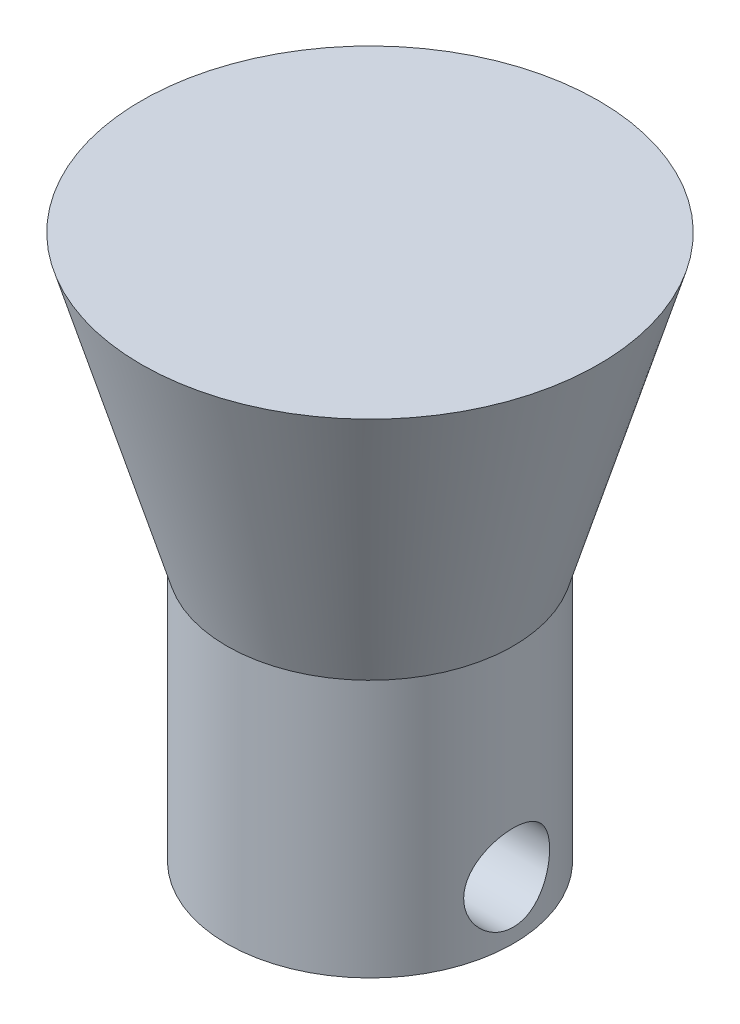
ISO-10303-21;
HEADER;
FILE_DESCRIPTION(('STEP AP214'),'2;1');
FILE_NAME('part.step','',(''),(''),'','','');
FILE_SCHEMA(('AUTOMOTIVE_DESIGN { 1 0 10303 214 1 1 1 1 }'));
ENDSEC;
DATA;
#1=APPLICATION_CONTEXT('core data for automotive mechanical design processes');
#2=APPLICATION_PROTOCOL_DEFINITION('international standard','automotive_design',2000,#1);
#3=PRODUCT_CONTEXT('',#1,'mechanical');
#4=PRODUCT('Part','Part','',(#3));
#5=PRODUCT_RELATED_PRODUCT_CATEGORY('part','',(#4));
#6=PRODUCT_DEFINITION_FORMATION('','',#4);
#7=PRODUCT_DEFINITION_CONTEXT('part definition',#1,'design');
#8=PRODUCT_DEFINITION('design','',#6,#7);
#9=PRODUCT_DEFINITION_SHAPE('','',#8);
#10=(LENGTH_UNIT() NAMED_UNIT(*) SI_UNIT(.MILLI.,.METRE.));
#11=(NAMED_UNIT(*) PLANE_ANGLE_UNIT() SI_UNIT($,.RADIAN.));
#12=(NAMED_UNIT(*) SI_UNIT($,.STERADIAN.) SOLID_ANGLE_UNIT());
#13=UNCERTAINTY_MEASURE_WITH_UNIT(LENGTH_MEASURE(1.E-05),#10,'distance_accuracy_value','');
#14=(GEOMETRIC_REPRESENTATION_CONTEXT(3) GLOBAL_UNCERTAINTY_ASSIGNED_CONTEXT((#13)) GLOBAL_UNIT_ASSIGNED_CONTEXT((#10,
#11,#12)) REPRESENTATION_CONTEXT('',''));
#15=CARTESIAN_POINT('',(0.,0.,0.));
#16=DIRECTION('',(0.,0.,1.));
#17=DIRECTION('',(1.,0.,0.));
#18=AXIS2_PLACEMENT_3D('',#15,#16,#17);
#19=CARTESIAN_POINT('',(0.,9.,0.));
#20=DIRECTION('',(0.,-1.,0.));
#21=DIRECTION('',(0.,0.,-1.));
#22=AXIS2_PLACEMENT_3D('',#19,#20,#21);
#23=CYLINDRICAL_SURFACE('',#22,5.);
#24=CARTESIAN_POINT('',(-5.,0.5,0.));
#25=CARTESIAN_POINT('',(-4.9999992925055,0.500000997484886,-0.0822886127533));
#26=CARTESIAN_POINT('',(-4.99794915693954,0.506793863623966,-0.164587318351529));
#27=CARTESIAN_POINT('',(-4.98997105593691,0.533721354222101,-0.326788125304881));
#28=CARTESIAN_POINT('',(-4.98404193389692,0.553859958023342,-0.40668950441142));
#29=CARTESIAN_POINT('',(-4.96895552501836,0.606746016910264,-0.561732707754527));
#30=CARTESIAN_POINT('',(-4.95980300250425,0.639474869618937,-0.636881364395373));
#31=CARTESIAN_POINT('',(-4.93922109237645,0.716536093055836,-0.780624181053131));
#32=CARTESIAN_POINT('',(-4.92779140192067,0.760870007395417,-0.84921746746967));
#33=CARTESIAN_POINT('',(-4.90350737192774,0.861224007472669,-0.979871797183745));
#34=CARTESIAN_POINT('',(-4.89062383657036,0.917516625885914,-1.04171807124434));
#35=CARTESIAN_POINT('',(-4.86505834210442,1.03960922991018,-1.15524920923324));
#36=CARTESIAN_POINT('',(-4.85237641724501,1.10541081212496,-1.20693236327441));
#37=CARTESIAN_POINT('',(-4.82834113993772,1.24647075303761,-1.29980037723708));
#38=CARTESIAN_POINT('',(-4.81702406663875,1.32190846099074,-1.34072309022213));
#39=CARTESIAN_POINT('',(-4.79743620394031,1.47898925423029,-1.4092139477476));
#40=CARTESIAN_POINT('',(-4.78916468313311,1.56063084392798,-1.43678529919973));
#41=CARTESIAN_POINT('',(-4.77690870838434,1.72539026613046,-1.47701633682652));
#42=CARTESIAN_POINT('',(-4.77281069324533,1.80840274386394,-1.49007196234677));
#43=CARTESIAN_POINT('',(-4.76902789749767,1.97553315621677,-1.50213730614672));
#44=CARTESIAN_POINT('',(-4.76934204760571,2.05965081805909,-1.50115042761078));
#45=CARTESIAN_POINT('',(-4.77424744067778,2.22338390860848,-1.48546977199812));
#46=CARTESIAN_POINT('',(-4.7786838859914,2.30305225036224,-1.47127205262685));
#47=CARTESIAN_POINT('',(-4.79108356228624,2.45881978627346,-1.43037420427056));
#48=CARTESIAN_POINT('',(-4.79904714132351,2.53491862737433,-1.40367284141641));
#49=CARTESIAN_POINT('',(-4.81772733074973,2.68260034966074,-1.33816026653682));
#50=CARTESIAN_POINT('',(-4.82848016115952,2.75410708395526,-1.29918816934642));
#51=CARTESIAN_POINT('',(-4.85150987000065,2.88973202201019,-1.21035222588683));
#52=CARTESIAN_POINT('',(-4.86378711746991,2.95384842941378,-1.16048574002588));
#53=CARTESIAN_POINT('',(-4.88911011297937,3.07568619076202,-1.04881290765546));
#54=CARTESIAN_POINT('',(-4.90216654310498,3.13302866402967,-0.986594907466972));
#55=CARTESIAN_POINT('',(-4.92712244063259,3.23655398406425,-0.853263259313967));
#56=CARTESIAN_POINT('',(-4.9390218351841,3.28273612841443,-0.782149051860888));
#57=CARTESIAN_POINT('',(-4.9604316006947,3.36285992246473,-0.632355038342803));
#58=CARTESIAN_POINT('',(-4.96992543668314,3.39671751624986,-0.55362774974795));
#59=CARTESIAN_POINT('',(-4.98533521832222,3.45059959009963,-0.39124541560352));
#60=CARTESIAN_POINT('',(-4.99125216186999,3.47062792853249,-0.307591751589582));
#61=CARTESIAN_POINT('',(-4.99868364643538,3.49565217789939,-0.140952242668332));
#62=CARTESIAN_POINT('',(-5.0003485041779,3.50116158580161,-0.0580500976011871));
#63=CARTESIAN_POINT('',(-4.9995292324176,3.49843084428792,0.107499605823383));
#64=CARTESIAN_POINT('',(-4.99704565677756,3.49019253034856,0.19014719669078));
#65=CARTESIAN_POINT('',(-4.98830696987163,3.4606153888885,0.350903605309697));
#66=CARTESIAN_POINT('',(-4.98213829799417,3.43957661241913,0.429072772614169));
#67=CARTESIAN_POINT('',(-4.96674347841533,3.3853567672218,0.580754638954522));
#68=CARTESIAN_POINT('',(-4.95751696321085,3.35217423896214,0.654266777025583));
#69=CARTESIAN_POINT('',(-4.93669654351325,3.27374683451887,0.796437189461052));
#70=CARTESIAN_POINT('',(-4.92505280829675,3.22824065905203,0.864943826199669));
#71=CARTESIAN_POINT('',(-4.90073468764318,3.12677524594719,0.993523307980147));
#72=CARTESIAN_POINT('',(-4.8880600443108,3.07081338811233,1.05359403235593));
#73=CARTESIAN_POINT('',(-4.86253171869138,2.94761269163066,1.16585744551027));
#74=CARTESIAN_POINT('',(-4.84968825033268,2.88003812422826,1.21768481231503));
#75=CARTESIAN_POINT('',(-4.82576515238464,2.73687206098647,1.30928995072154));
#76=CARTESIAN_POINT('',(-4.81468547654651,2.66128077544179,1.34906803829472));
#77=CARTESIAN_POINT('',(-4.79567189615055,2.50446750874531,1.41517347127168));
#78=CARTESIAN_POINT('',(-4.78772337843827,2.42327381346341,1.4415634693705));
#79=CARTESIAN_POINT('',(-4.77591594362794,2.25731203106852,1.48021730815114));
#80=CARTESIAN_POINT('',(-4.772055625083,2.17254517921233,1.49248598978779));
#81=CARTESIAN_POINT('',(-4.76899972496087,2.00563848162377,1.50221984485059));
#82=CARTESIAN_POINT('',(-4.76961647442754,1.92353634898242,1.5002805530849));
#83=CARTESIAN_POINT('',(-4.77499401288294,1.7608858966272,1.48307505444813));
#84=CARTESIAN_POINT('',(-4.77975463592551,1.68033751482365,1.46780938124716));
#85=CARTESIAN_POINT('',(-4.79275763670385,1.52405460085715,1.42476888804136));
#86=CARTESIAN_POINT('',(-4.80095604545965,1.44827271263831,1.39715175507068));
#87=CARTESIAN_POINT('',(-4.81990278909136,1.30235756118228,1.33031507121129));
#88=CARTESIAN_POINT('',(-4.83065161194312,1.23222538235924,1.29109329962876));
#89=CARTESIAN_POINT('',(-4.85397676425833,1.09683688347289,1.20048763805072));
#90=CARTESIAN_POINT('',(-4.86660540163798,1.03185123873959,1.14871276092994));
#91=CARTESIAN_POINT('',(-4.89201320450026,0.911297501692137,1.03517434629782));
#92=CARTESIAN_POINT('',(-4.90479240823905,0.855731860532243,0.973408217134502));
#93=CARTESIAN_POINT('',(-4.92950936570649,0.75397658770497,0.839465762183249));
#94=CARTESIAN_POINT('',(-4.94141159765674,0.708108553144511,0.767037885790608));
#95=CARTESIAN_POINT('',(-4.96260680455813,0.629264830095975,0.615141373983529));
#96=CARTESIAN_POINT('',(-4.97190099931067,0.596283111725492,0.535676052998955));
#97=CARTESIAN_POINT('',(-4.98602174969301,0.547104724347251,0.380757712655282));
#98=CARTESIAN_POINT('',(-4.99122027381068,0.529488327116752,0.305786961954234));
#99=CARTESIAN_POINT('',(-4.99820944494492,0.505936474758423,0.15388019523078));
#100=CARTESIAN_POINT('',(-5.0000006615474,0.499999067295181,0.0769445098581397));
#101=CARTESIAN_POINT('',(-5.,0.5,0.));
#102=B_SPLINE_CURVE_WITH_KNOTS('',3,(#24,#25,#26,#27,#28,#29,#30,#31,#32,#33,#34,#35,#36,#37,
#38,#39,#40,#41,#42,#43,#44,#45,#46,#47,#48,#49,#50,#51,#52,#53,#54,#55,#56,#57,#58,#59,#60,#61,
#62,#63,#64,#65,#66,#67,#68,#69,#70,#71,#72,#73,#74,#75,#76,#77,#78,#79,#80,#81,#82,#83,#84,#85,
#86,#87,#88,#89,#90,#91,#92,#93,#94,#95,#96,#97,#98,#99,#100,#101),.UNSPECIFIED.,.T.,.F.,(4,2,2,
2,2,2,2,2,2,2,2,2,2,2,2,2,2,2,2,2,2,2,2,2,2,2,2,2,2,2,2,2,2,2,2,2,2,2,4),(0.,0.246583203612611,
0.493239964846,0.739533676300874,0.985860164412702,1.23855602948191,1.49129437288633,
1.74971481004109,2.00807314543224,2.25919689356599,2.51025978319089,2.75226016697676,
2.99428443658001,3.23962426447119,3.48502360158555,3.74067104048166,3.99633456531071,
4.25371046881688,4.51101453528808,4.75908809438545,5.00712853550327,5.24956746682327,
5.49203554593728,5.74011305702908,5.98825282000191,6.24540400322818,6.5025484425268,
6.75847814951252,7.01432009460283,7.25950155466943,7.504673196616,7.74680040402721,
7.98897397553107,8.23996925679931,8.49102974897502,8.74942996156671,9.00770911595235,
9.23831691930459,9.46888616948874),.UNSPECIFIED.);
#103=CARTESIAN_POINT('',(-5.,0.5,0.));
#104=VERTEX_POINT('',#103);
#105=EDGE_CURVE('E11',#104,#104,#102,.T.);
#106=ORIENTED_EDGE('',*,*,#105,.T.);
#107=EDGE_LOOP('',(#106));
#108=FACE_BOUND('',#107,.T.);
#109=CARTESIAN_POINT('',(4.76969600708473,2.,-1.5));
#110=CARTESIAN_POINT('',(4.7696968572698,1.9178054520576,-1.49999897633764));
#111=CARTESIAN_POINT('',(4.77184390209069,1.83560077585598,-1.49322108167142));
#112=CARTESIAN_POINT('',(4.780165783029,1.67359475040806,-1.46635844446749));
#113=CARTESIAN_POINT('',(4.78634196493468,1.59379421349853,-1.44626925573578));
#114=CARTESIAN_POINT('',(4.80196102485632,1.43896527172827,-1.39352753269955));
#115=CARTESIAN_POINT('',(4.81139846703232,1.36392917036691,-1.36089589394243));
#116=CARTESIAN_POINT('',(4.83246932547567,1.2203780660047,-1.28406421917929));
#117=CARTESIAN_POINT('',(4.84410307041019,1.15186404131556,-1.23986245137053));
#118=CARTESIAN_POINT('',(4.86866862185765,1.02113360942262,-1.13964754141627));
#119=CARTESIAN_POINT('',(4.88162808311636,0.959154102053713,-1.08333207175807));
#120=CARTESIAN_POINT('',(4.90714861936757,0.845362048677491,-0.961136237579599));
#121=CARTESIAN_POINT('',(4.91970964297705,0.793550809550121,-0.895254645461111));
#122=CARTESIAN_POINT('',(4.94333214579389,0.700537300166693,-0.75411143779369));
#123=CARTESIAN_POINT('',(4.95435724342404,0.659576575557191,-0.678684021335815));
#124=CARTESIAN_POINT('',(4.97334435920684,0.591012740957243,-0.521624645369354));
#125=CARTESIAN_POINT('',(4.98130703789495,0.563406750142551,-0.439994028387912));
#126=CARTESIAN_POINT('',(4.99307646003589,0.523119998909491,-0.27532385263083));
#127=CARTESIAN_POINT('',(4.99699557369338,0.510034872347297,-0.192391398953801));
#128=CARTESIAN_POINT('',(5.00063201501348,0.497882675353559,-0.025421823749315));
#129=CARTESIAN_POINT('',(5.00035022521079,0.498812660598037,0.0586150620503682));
#130=CARTESIAN_POINT('',(4.99569603817659,0.514392868543023,0.22257115660016));
#131=CARTESIAN_POINT('',(4.9914542020526,0.528605193809869,0.302536267641341));
#132=CARTESIAN_POINT('',(4.97951522112593,0.56963133599429,0.458889213442527));
#133=CARTESIAN_POINT('',(4.97181785750586,0.596445950942671,0.535276821322846));
#134=CARTESIAN_POINT('',(4.95365220986963,0.662212023418558,0.683347326351281));
#135=CARTESIAN_POINT('',(4.94315269676706,0.701301202807267,0.754965064694478));
#136=CARTESIAN_POINT('',(4.92049640648069,0.790397852428228,0.890764673783156));
#137=CARTESIAN_POINT('',(4.90833923637778,0.840407912963484,0.954944774872131));
#138=CARTESIAN_POINT('',(4.88311550488165,0.952197750751597,1.0766604815298));
#139=CARTESIAN_POINT('',(4.87003195321461,1.01435691902974,1.13384458040111));
#140=CARTESIAN_POINT('',(4.84483979887497,1.14751001789005,1.23707651539824));
#141=CARTESIAN_POINT('',(4.8327312931702,1.21850482538923,1.28312324482853));
#142=CARTESIAN_POINT('',(4.81077903197678,1.36823946924899,1.3631399533545));
#143=CARTESIAN_POINT('',(4.80095810695957,1.44704704586292,1.39698989237679));
#144=CARTESIAN_POINT('',(4.78496392548436,1.60960720844554,1.45083362878413));
#145=CARTESIAN_POINT('',(4.7787894791583,1.69335817153456,1.4708319464056));
#146=CARTESIAN_POINT('',(4.77104849541241,1.86008236073928,1.49574770282165));
#147=CARTESIAN_POINT('',(4.7693187867044,1.94296822389398,1.50119946380212));
#148=CARTESIAN_POINT('',(4.77021192441924,2.10847290000987,1.49835947233062));
#149=CARTESIAN_POINT('',(4.77283416156589,2.19109174873085,1.4900696437133));
#150=CARTESIAN_POINT('',(4.78197558554912,2.35148837797087,1.4604576357419));
#151=CARTESIAN_POINT('',(4.78839176507489,2.42933616426352,1.4394796143128));
#152=CARTESIAN_POINT('',(4.80429141231227,2.58040169081492,1.3854857774794));
#153=CARTESIAN_POINT('',(4.81377535359073,2.65361871414057,1.3524681034276));
#154=CARTESIAN_POINT('',(4.83505835023047,2.79551746407213,1.274318711965));
#155=CARTESIAN_POINT('',(4.84691271069799,2.86402472098579,1.22888564172729));
#156=CARTESIAN_POINT('',(4.87148205646987,2.9926381061808,1.12755301600385));
#157=CARTESIAN_POINT('',(4.88419724730003,3.05274221761279,1.07165095534897));
#158=CARTESIAN_POINT('',(4.90963633548158,3.16518040581474,0.948455132493599));
#159=CARTESIAN_POINT('',(4.92234245063004,3.21713562898698,0.880811065857434));
#160=CARTESIAN_POINT('',(4.94584851748651,3.30896670102775,0.737461784590249));
#161=CARTESIAN_POINT('',(4.95664856384717,3.34884314978146,0.661756970543944));
#162=CARTESIAN_POINT('',(4.97505970474957,3.4150000305683,0.504935504705222));
#163=CARTESIAN_POINT('',(4.98269453424966,3.44138201615898,0.423864622037839));
#164=CARTESIAN_POINT('',(4.99401979596827,3.48006091889042,0.258169966504588));
#165=CARTESIAN_POINT('',(4.9977113567088,3.49236186594842,0.173547217354763));
#166=CARTESIAN_POINT('',(5.00066544081399,3.5022230440545,0.00665215388274265));
#167=CARTESIAN_POINT('',(5.00009305111322,3.50033269540783,-0.0755851790862068));
#168=CARTESIAN_POINT('',(4.99497264465037,3.48317836750088,-0.238519481164404));
#169=CARTESIAN_POINT('',(4.99042485330462,3.46791514651956,-0.319216537346529));
#170=CARTESIAN_POINT('',(4.97791168358327,3.42478833860038,-0.475935813041358));
#171=CARTESIAN_POINT('',(4.96998352900866,3.39706181935099,-0.551998927351392));
#172=CARTESIAN_POINT('',(4.9515294303945,3.32991808549281,-0.698433237752053));
#173=CARTESIAN_POINT('',(4.94100305949946,3.29049894971381,-0.76880349605058));
#174=CARTESIAN_POINT('',(4.91803965828228,3.19962654256996,-0.904301892420563));
#175=CARTESIAN_POINT('',(4.90555226923559,3.14782856999923,-0.969190250076767));
#176=CARTESIAN_POINT('',(4.88023537212334,3.0342896116672,-1.08953757134594));
#177=CARTESIAN_POINT('',(4.86740576641079,2.97254576210185,-1.14499380960194));
#178=CARTESIAN_POINT('',(4.84240680631319,2.83865922168949,-1.24656269394549));
#179=CARTESIAN_POINT('',(4.83026852693485,2.76626144660956,-1.29234759757956));
#180=CARTESIAN_POINT('',(4.80852547508793,2.61444482583898,-1.37104313528776));
#181=CARTESIAN_POINT('',(4.79891948596956,2.53502937639881,-1.40395995557289));
#182=CARTESIAN_POINT('',(4.78427816717594,2.38025956839373,-1.4530194253295));
#183=CARTESIAN_POINT('',(4.7788615484052,2.30539135306901,-1.47058859011232));
#184=CARTESIAN_POINT('',(4.77157042597167,2.15368477750423,-1.49407818835144));
#185=CARTESIAN_POINT('',(4.7696952122143,2.07684681535475,-1.50000095706095));
#186=CARTESIAN_POINT('',(4.76969600708473,2.,-1.5));
#187=B_SPLINE_CURVE_WITH_KNOTS('',3,(#109,#110,#111,#112,#113,#114,#115,#116,#117,#118,#119,
#120,#121,#122,#123,#124,#125,#126,#127,#128,#129,#130,#131,#132,#133,#134,#135,#136,#137,#138,
#139,#140,#141,#142,#143,#144,#145,#146,#147,#148,#149,#150,#151,#152,#153,#154,#155,#156,#157,
#158,#159,#160,#161,#162,#163,#164,#165,#166,#167,#168,#169,#170,#171,#172,#173,#174,#175,#176,
#177,#178,#179,#180,#181,#182,#183,#184,#185,#186),.UNSPECIFIED.,.T.,.F.,(4,2,2,2,2,2,2,2,2,2,2,
2,2,2,2,2,2,2,2,2,2,2,2,2,2,2,2,2,2,2,2,2,2,2,2,2,2,2,4),(0.,0.246300165915542,0.492682641689,
0.738656414466193,0.984667025370101,1.23773150007984,1.49082847871273,1.74915939273645,
2.00743455587877,2.25832140149558,2.5091555410144,2.7520012599088,2.99486235890376,
3.24055209335676,3.4863001659083,3.74152147023278,3.99676812491863,4.25446238246266,
4.51207250628411,4.76008080790309,5.00805439107388,5.24958594938817,5.49115481045787,
5.73920731809388,5.98731925928923,6.24479506100602,6.50225807324202,6.75775391814325,
7.01317662321682,7.2587630391122,7.50433553047755,7.74727096872219,7.99024634491378,
8.24099627054488,8.4918185262989,8.75011639669147,9.00828993963944,9.23861153857447,
9.4688869503356),.UNSPECIFIED.);
#188=CARTESIAN_POINT('',(4.76969600708473,2.,-1.5));
#189=VERTEX_POINT('',#188);
#190=EDGE_CURVE('E41',#189,#189,#187,.T.);
#191=ORIENTED_EDGE('',*,*,#190,.T.);
#192=EDGE_LOOP('',(#191));
#193=FACE_BOUND('',#192,.T.);
#194=CARTESIAN_POINT('',(0.,9.,0.));
#195=DIRECTION('',(0.,1.,0.));
#196=DIRECTION('',(0.,0.,1.));
#197=AXIS2_PLACEMENT_3D('',#194,#195,#196);
#198=CIRCLE('',#197,5.);
#199=CARTESIAN_POINT('',(0.,9.,5.));
#200=VERTEX_POINT('',#199);
#201=EDGE_CURVE('E46',#200,#200,#198,.T.);
#202=ORIENTED_EDGE('',*,*,#201,.F.);
#203=EDGE_LOOP('',(#202));
#204=FACE_BOUND('',#203,.T.);
#205=CARTESIAN_POINT('',(0.,0.,0.));
#206=DIRECTION('',(0.,1.,0.));
#207=DIRECTION('',(0.,0.,1.));
#208=AXIS2_PLACEMENT_3D('',#205,#206,#207);
#209=CIRCLE('',#208,5.);
#210=CARTESIAN_POINT('',(0.,0.,5.));
#211=VERTEX_POINT('',#210);
#212=EDGE_CURVE('E72',#211,#211,#209,.T.);
#213=ORIENTED_EDGE('',*,*,#212,.T.);
#214=EDGE_LOOP('',(#213));
#215=FACE_BOUND('',#214,.T.);
#216=ADVANCED_FACE('F33',(#108,#193,#204,#215),#23,.T.);
#217=CARTESIAN_POINT('',(0.,0.,0.));
#218=DIRECTION('',(0.,1.,0.));
#219=DIRECTION('',(0.,0.,1.));
#220=AXIS2_PLACEMENT_3D('',#217,#218,#219);
#221=PLANE('',#220);
#222=ORIENTED_EDGE('',*,*,#212,.F.);
#223=EDGE_LOOP('',(#222));
#224=FACE_BOUND('',#223,.T.);
#225=ADVANCED_FACE('F59',(#224),#221,.F.);
#226=CARTESIAN_POINT('',(-5.,2.,0.));
#227=DIRECTION('',(1.,0.,0.));
#228=DIRECTION('',(0.,0.,-1.));
#229=AXIS2_PLACEMENT_3D('',#226,#227,#228);
#230=CYLINDRICAL_SURFACE('',#229,1.5);
#231=ORIENTED_EDGE('',*,*,#190,.F.);
#232=EDGE_LOOP('',(#231));
#233=FACE_BOUND('',#232,.T.);
#234=ORIENTED_EDGE('',*,*,#105,.F.);
#235=EDGE_LOOP('',(#234));
#236=FACE_BOUND('',#235,.T.);
#237=ADVANCED_FACE('F54',(#233,#236),#230,.F.);
#238=CARTESIAN_POINT('',(0.,19.,0.));
#239=DIRECTION('',(0.,1.,0.));
#240=DIRECTION('',(0.,0.,1.));
#241=AXIS2_PLACEMENT_3D('',#238,#239,#240);
#242=PLANE('',#241);
#243=CARTESIAN_POINT('',(0.,19.,0.));
#244=DIRECTION('',(0.,1.,0.));
#245=DIRECTION('',(0.,0.,1.));
#246=AXIS2_PLACEMENT_3D('',#243,#244,#245);
#247=CIRCLE('',#246,7.979);
#248=CARTESIAN_POINT('',(0.,19.,7.979));
#249=VERTEX_POINT('',#248);
#250=EDGE_CURVE('E74',#249,#249,#247,.T.);
#251=ORIENTED_EDGE('',*,*,#250,.T.);
#252=EDGE_LOOP('',(#251));
#253=FACE_BOUND('',#252,.T.);
#254=ADVANCED_FACE('F58',(#253),#242,.T.);
#255=CARTESIAN_POINT('',(0.,9.,0.));
#256=DIRECTION('',(0.,1.,0.));
#257=DIRECTION('',(0.,0.,1.));
#258=AXIS2_PLACEMENT_3D('',#255,#256,#257);
#259=CONICAL_SURFACE('',#258,5.,0.289529077174533);
#260=ORIENTED_EDGE('',*,*,#250,.F.);
#261=EDGE_LOOP('',(#260));
#262=FACE_BOUND('',#261,.T.);
#263=ORIENTED_EDGE('',*,*,#201,.T.);
#264=EDGE_LOOP('',(#263));
#265=FACE_BOUND('',#264,.T.);
#266=ADVANCED_FACE('F61',(#262,#265),#259,.T.);
#267=CLOSED_SHELL('',(#216,#225,#237,#254,#266));
#268=MANIFOLD_SOLID_BREP('B2',#267);
#269=ADVANCED_BREP_SHAPE_REPRESENTATION('',(#18,#268),#14);
#270=SHAPE_DEFINITION_REPRESENTATION(#9,#269);
ENDSEC;
END-ISO-10303-21;
